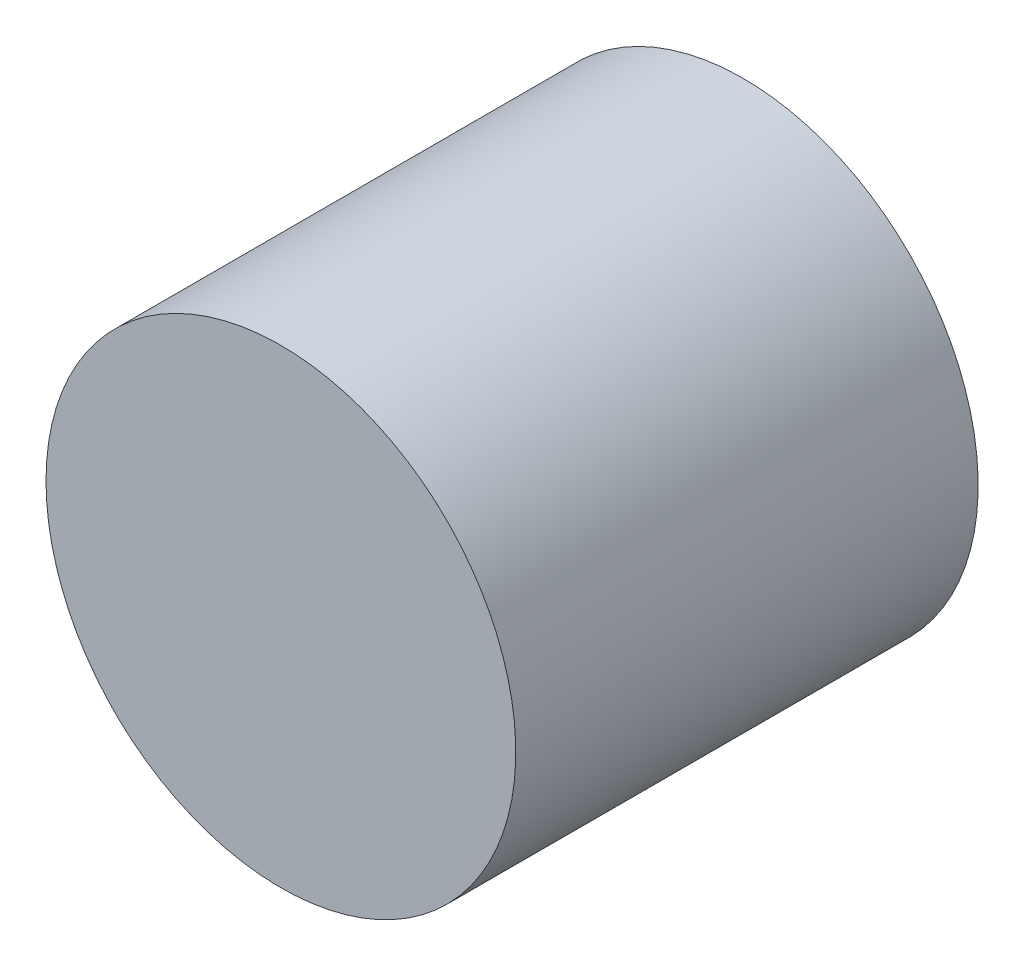
ISO-10303-21;
HEADER;
FILE_DESCRIPTION(('STEP AP214'),'2;1');
FILE_NAME('part.step','',(''),(''),'','','');
FILE_SCHEMA(('AUTOMOTIVE_DESIGN { 1 0 10303 214 1 1 1 1 }'));
ENDSEC;
DATA;
#1=APPLICATION_CONTEXT('core data for automotive mechanical design processes');
#2=APPLICATION_PROTOCOL_DEFINITION('international standard','automotive_design',2000,#1);
#3=PRODUCT_CONTEXT('',#1,'mechanical');
#4=PRODUCT('Part','Part','',(#3));
#5=PRODUCT_RELATED_PRODUCT_CATEGORY('part','',(#4));
#6=PRODUCT_DEFINITION_FORMATION('','',#4);
#7=PRODUCT_DEFINITION_CONTEXT('part definition',#1,'design');
#8=PRODUCT_DEFINITION('design','',#6,#7);
#9=PRODUCT_DEFINITION_SHAPE('','',#8);
#10=(LENGTH_UNIT() NAMED_UNIT(*) SI_UNIT(.MILLI.,.METRE.));
#11=(NAMED_UNIT(*) PLANE_ANGLE_UNIT() SI_UNIT($,.RADIAN.));
#12=(NAMED_UNIT(*) SI_UNIT($,.STERADIAN.) SOLID_ANGLE_UNIT());
#13=UNCERTAINTY_MEASURE_WITH_UNIT(LENGTH_MEASURE(1.E-05),#10,'distance_accuracy_value','');
#14=(GEOMETRIC_REPRESENTATION_CONTEXT(3) GLOBAL_UNCERTAINTY_ASSIGNED_CONTEXT((#13)) GLOBAL_UNIT_ASSIGNED_CONTEXT((#10,
#11,#12)) REPRESENTATION_CONTEXT('',''));
#15=CARTESIAN_POINT('',(0.,0.,0.));
#16=DIRECTION('',(0.,0.,1.));
#17=DIRECTION('',(1.,0.,0.));
#18=AXIS2_PLACEMENT_3D('',#15,#16,#17);
#19=CARTESIAN_POINT('',(0.,0.,50.));
#20=DIRECTION('',(0.,0.,1.));
#21=DIRECTION('',(1.,0.,0.));
#22=AXIS2_PLACEMENT_3D('',#19,#20,#21);
#23=PLANE('',#22);
#24=CARTESIAN_POINT('',(0.,0.,50.));
#25=DIRECTION('',(0.,0.,-1.));
#26=DIRECTION('',(-1.,0.,0.));
#27=AXIS2_PLACEMENT_3D('',#24,#25,#26);
#28=CIRCLE('',#27,25.4);
#29=CARTESIAN_POINT('',(-25.4,0.,50.));
#30=VERTEX_POINT('',#29);
#31=EDGE_CURVE('E18',#30,#30,#28,.T.);
#32=ORIENTED_EDGE('',*,*,#31,.F.);
#33=EDGE_LOOP('',(#32));
#34=FACE_BOUND('',#33,.T.);
#35=ADVANCED_FACE('F15',(#34),#23,.T.);
#36=CARTESIAN_POINT('',(0.,0.,0.));
#37=DIRECTION('',(0.,0.,1.));
#38=DIRECTION('',(1.,0.,0.));
#39=AXIS2_PLACEMENT_3D('',#36,#37,#38);
#40=PLANE('',#39);
#41=CARTESIAN_POINT('',(0.,0.,0.));
#42=DIRECTION('',(0.,0.,-1.));
#43=DIRECTION('',(-1.,0.,0.));
#44=AXIS2_PLACEMENT_3D('',#41,#42,#43);
#45=CIRCLE('',#44,25.4);
#46=CARTESIAN_POINT('',(-25.4,0.,0.));
#47=VERTEX_POINT('',#46);
#48=EDGE_CURVE('E10',#47,#47,#45,.F.);
#49=ORIENTED_EDGE('',*,*,#48,.F.);
#50=EDGE_LOOP('',(#49));
#51=FACE_BOUND('',#50,.T.);
#52=ADVANCED_FACE('F30',(#51),#40,.F.);
#53=CARTESIAN_POINT('',(0.,0.,50.));
#54=DIRECTION('',(0.,0.,-1.));
#55=DIRECTION('',(-1.,0.,0.));
#56=AXIS2_PLACEMENT_3D('',#53,#54,#55);
#57=CYLINDRICAL_SURFACE('',#56,25.4);
#58=ORIENTED_EDGE('',*,*,#48,.T.);
#59=EDGE_LOOP('',(#58));
#60=FACE_BOUND('',#59,.T.);
#61=ORIENTED_EDGE('',*,*,#31,.T.);
#62=EDGE_LOOP('',(#61));
#63=FACE_BOUND('',#62,.T.);
#64=ADVANCED_FACE('F27',(#60,#63),#57,.T.);
#65=CLOSED_SHELL('',(#35,#52,#64));
#66=MANIFOLD_SOLID_BREP('B1',#65);
#67=ADVANCED_BREP_SHAPE_REPRESENTATION('',(#18,#66),#14);
#68=SHAPE_DEFINITION_REPRESENTATION(#9,#67);
ENDSEC;
END-ISO-10303-21;
